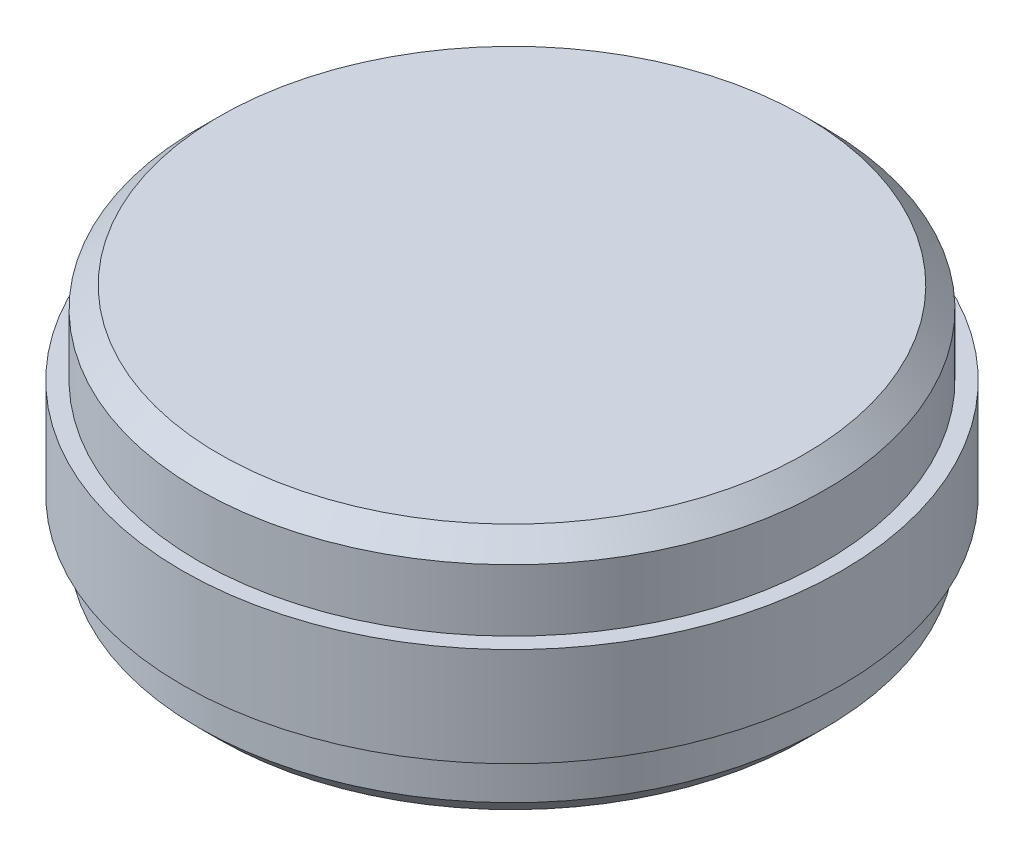
ISO-10303-21;
HEADER;
FILE_DESCRIPTION(('STEP AP214'),'2;1');
FILE_NAME('part.step','',(''),(''),'','','');
FILE_SCHEMA(('AUTOMOTIVE_DESIGN { 1 0 10303 214 1 1 1 1 }'));
ENDSEC;
DATA;
#1=APPLICATION_CONTEXT('core data for automotive mechanical design processes');
#2=APPLICATION_PROTOCOL_DEFINITION('international standard','automotive_design',2000,#1);
#3=PRODUCT_CONTEXT('',#1,'mechanical');
#4=PRODUCT('Part','Part','',(#3));
#5=PRODUCT_RELATED_PRODUCT_CATEGORY('part','',(#4));
#6=PRODUCT_DEFINITION_FORMATION('','',#4);
#7=PRODUCT_DEFINITION_CONTEXT('part definition',#1,'design');
#8=PRODUCT_DEFINITION('design','',#6,#7);
#9=PRODUCT_DEFINITION_SHAPE('','',#8);
#10=(LENGTH_UNIT() NAMED_UNIT(*) SI_UNIT(.MILLI.,.METRE.));
#11=(NAMED_UNIT(*) PLANE_ANGLE_UNIT() SI_UNIT($,.RADIAN.));
#12=(NAMED_UNIT(*) SI_UNIT($,.STERADIAN.) SOLID_ANGLE_UNIT());
#13=UNCERTAINTY_MEASURE_WITH_UNIT(LENGTH_MEASURE(1.E-05),#10,'distance_accuracy_value','');
#14=(GEOMETRIC_REPRESENTATION_CONTEXT(3) GLOBAL_UNCERTAINTY_ASSIGNED_CONTEXT((#13)) GLOBAL_UNIT_ASSIGNED_CONTEXT((#10,
#11,#12)) REPRESENTATION_CONTEXT('',''));
#15=CARTESIAN_POINT('',(0.,0.,0.));
#16=DIRECTION('',(0.,0.,1.));
#17=DIRECTION('',(1.,0.,0.));
#18=AXIS2_PLACEMENT_3D('',#15,#16,#17);
#19=CARTESIAN_POINT('',(0.,0.,0.));
#20=DIRECTION('',(0.,-1.,0.));
#21=DIRECTION('',(0.,0.,-1.));
#22=AXIS2_PLACEMENT_3D('',#19,#20,#21);
#23=PLANE('',#22);
#24=CARTESIAN_POINT('',(0.,0.,0.));
#25=DIRECTION('',(0.,-1.,0.));
#26=DIRECTION('',(0.,0.,-1.));
#27=AXIS2_PLACEMENT_3D('',#24,#25,#26);
#28=CIRCLE('',#27,22.5425);
#29=CARTESIAN_POINT('',(0.,0.,-22.5425));
#30=VERTEX_POINT('',#29);
#31=EDGE_CURVE('E60',#30,#30,#28,.F.);
#32=ORIENTED_EDGE('',*,*,#31,.T.);
#33=EDGE_LOOP('',(#32));
#34=FACE_BOUND('',#33,.T.);
#35=ADVANCED_FACE('F41',(#34),#23,.F.);
#36=CARTESIAN_POINT('',(0.,0.,0.));
#37=DIRECTION('',(0.,1.,0.));
#38=DIRECTION('',(0.,0.,1.));
#39=AXIS2_PLACEMENT_3D('',#36,#37,#38);
#40=CYLINDRICAL_SURFACE('',#39,24.13);
#41=CARTESIAN_POINT('',(0.,-1.58750000000001,0.));
#42=DIRECTION('',(0.,-1.,0.));
#43=DIRECTION('',(0.,0.,-1.));
#44=AXIS2_PLACEMENT_3D('',#41,#42,#43);
#45=CIRCLE('',#44,24.13);
#46=CARTESIAN_POINT('',(0.,-1.58750000000001,-24.13));
#47=VERTEX_POINT('',#46);
#48=EDGE_CURVE('E55',#47,#47,#45,.T.);
#49=ORIENTED_EDGE('',*,*,#48,.T.);
#50=EDGE_LOOP('',(#49));
#51=FACE_BOUND('',#50,.T.);
#52=CARTESIAN_POINT('',(0.,-6.35,0.));
#53=DIRECTION('',(0.,1.,0.));
#54=DIRECTION('',(0.,0.,1.));
#55=AXIS2_PLACEMENT_3D('',#52,#53,#54);
#56=CIRCLE('',#55,24.13);
#57=CARTESIAN_POINT('',(0.,-6.35,24.13));
#58=VERTEX_POINT('',#57);
#59=EDGE_CURVE('E66',#58,#58,#56,.T.);
#60=ORIENTED_EDGE('',*,*,#59,.T.);
#61=EDGE_LOOP('',(#60));
#62=FACE_BOUND('',#61,.T.);
#63=ADVANCED_FACE('F99',(#51,#62),#40,.T.);
#64=CARTESIAN_POINT('',(24.13,-6.35,0.));
#65=DIRECTION('',(0.,-1.,0.));
#66=DIRECTION('',(0.,0.,-1.));
#67=AXIS2_PLACEMENT_3D('',#64,#65,#66);
#68=PLANE('',#67);
#69=ORIENTED_EDGE('',*,*,#59,.F.);
#70=EDGE_LOOP('',(#69));
#71=FACE_BOUND('',#70,.T.);
#72=CARTESIAN_POINT('',(0.,-6.35,0.));
#73=DIRECTION('',(0.,1.,0.));
#74=DIRECTION('',(0.,0.,1.));
#75=AXIS2_PLACEMENT_3D('',#72,#73,#74);
#76=CIRCLE('',#75,25.4);
#77=CARTESIAN_POINT('',(0.,-6.35,25.4));
#78=VERTEX_POINT('',#77);
#79=EDGE_CURVE('E70',#78,#78,#76,.T.);
#80=ORIENTED_EDGE('',*,*,#79,.T.);
#81=EDGE_LOOP('',(#80));
#82=FACE_BOUND('',#81,.T.);
#83=ADVANCED_FACE('F105',(#71,#82),#68,.F.);
#84=CARTESIAN_POINT('',(0.,0.,0.));
#85=DIRECTION('',(0.,1.,0.));
#86=DIRECTION('',(0.,0.,1.));
#87=AXIS2_PLACEMENT_3D('',#84,#85,#86);
#88=CYLINDRICAL_SURFACE('',#87,25.4);
#89=ORIENTED_EDGE('',*,*,#79,.F.);
#90=EDGE_LOOP('',(#89));
#91=FACE_BOUND('',#90,.T.);
#92=CARTESIAN_POINT('',(0.,-13.97,0.));
#93=DIRECTION('',(0.,1.,0.));
#94=DIRECTION('',(0.,0.,1.));
#95=AXIS2_PLACEMENT_3D('',#92,#93,#94);
#96=CIRCLE('',#95,25.4);
#97=CARTESIAN_POINT('',(0.,-13.97,25.4));
#98=VERTEX_POINT('',#97);
#99=EDGE_CURVE('E74',#98,#98,#96,.T.);
#100=ORIENTED_EDGE('',*,*,#99,.T.);
#101=EDGE_LOOP('',(#100));
#102=FACE_BOUND('',#101,.T.);
#103=ADVANCED_FACE('F95',(#91,#102),#88,.T.);
#104=CARTESIAN_POINT('',(25.4,-13.97,0.));
#105=DIRECTION('',(0.,1.,0.));
#106=DIRECTION('',(0.,0.,1.));
#107=AXIS2_PLACEMENT_3D('',#104,#105,#106);
#108=PLANE('',#107);
#109=ORIENTED_EDGE('',*,*,#99,.F.);
#110=EDGE_LOOP('',(#109));
#111=FACE_BOUND('',#110,.T.);
#112=CARTESIAN_POINT('',(0.,-13.97,0.));
#113=DIRECTION('',(0.,1.,0.));
#114=DIRECTION('',(0.,0.,1.));
#115=AXIS2_PLACEMENT_3D('',#112,#113,#114);
#116=CIRCLE('',#115,24.13);
#117=CARTESIAN_POINT('',(0.,-13.97,24.13));
#118=VERTEX_POINT('',#117);
#119=EDGE_CURVE('E78',#118,#118,#116,.T.);
#120=ORIENTED_EDGE('',*,*,#119,.T.);
#121=EDGE_LOOP('',(#120));
#122=FACE_BOUND('',#121,.T.);
#123=ADVANCED_FACE('F83',(#111,#122),#108,.F.);
#124=CARTESIAN_POINT('',(0.,0.,0.));
#125=DIRECTION('',(0.,1.,0.));
#126=DIRECTION('',(0.,0.,1.));
#127=AXIS2_PLACEMENT_3D('',#124,#125,#126);
#128=CYLINDRICAL_SURFACE('',#127,24.13);
#129=CARTESIAN_POINT('',(0.,-17.4625,0.));
#130=DIRECTION('',(0.,1.,0.));
#131=DIRECTION('',(0.,0.,1.));
#132=AXIS2_PLACEMENT_3D('',#129,#130,#131);
#133=CIRCLE('',#132,24.13);
#134=CARTESIAN_POINT('',(0.,-17.4625,24.13));
#135=VERTEX_POINT('',#134);
#136=EDGE_CURVE('E50',#135,#135,#133,.T.);
#137=ORIENTED_EDGE('',*,*,#136,.T.);
#138=EDGE_LOOP('',(#137));
#139=FACE_BOUND('',#138,.T.);
#140=ORIENTED_EDGE('',*,*,#119,.F.);
#141=EDGE_LOOP('',(#140));
#142=FACE_BOUND('',#141,.T.);
#143=ADVANCED_FACE('F85',(#139,#142),#128,.T.);
#144=CARTESIAN_POINT('',(24.13,-19.05,0.));
#145=DIRECTION('',(0.,1.,0.));
#146=DIRECTION('',(0.,0.,1.));
#147=AXIS2_PLACEMENT_3D('',#144,#145,#146);
#148=PLANE('',#147);
#149=CARTESIAN_POINT('',(0.,-19.05,0.));
#150=DIRECTION('',(0.,1.,0.));
#151=DIRECTION('',(0.,0.,1.));
#152=AXIS2_PLACEMENT_3D('',#149,#150,#151);
#153=CIRCLE('',#152,22.5425);
#154=CARTESIAN_POINT('',(0.,-19.05,22.5425));
#155=VERTEX_POINT('',#154);
#156=EDGE_CURVE('E10',#155,#155,#153,.F.);
#157=ORIENTED_EDGE('',*,*,#156,.T.);
#158=EDGE_LOOP('',(#157));
#159=FACE_BOUND('',#158,.T.);
#160=ADVANCED_FACE('F87',(#159),#148,.F.);
#161=CARTESIAN_POINT('',(0.,0.,0.));
#162=DIRECTION('',(0.,-1.,0.));
#163=DIRECTION('',(0.,0.,-1.));
#164=AXIS2_PLACEMENT_3D('',#161,#162,#163);
#165=CONICAL_SURFACE('',#164,22.5425,0.785398163397444);
#166=CARTESIAN_POINT('',(0.,-1.58750000000001,-24.13));
#167=CARTESIAN_POINT('',(0.,-1.57096354166667,-24.1134635416667));
#168=CARTESIAN_POINT('',(0.,-1.55442708333334,-24.0969270833333));
#169=CARTESIAN_POINT('',(0.,-1.52135416666667,-24.0638541666667));
#170=CARTESIAN_POINT('',(0.,-1.50481770833334,-24.0473177083333));
#171=CARTESIAN_POINT('',(0.,-1.47174479166667,-24.0142447916667));
#172=CARTESIAN_POINT('',(0.,-1.45520833333334,-23.9977083333333));
#173=CARTESIAN_POINT('',(0.,-1.42213541666667,-23.9646354166667));
#174=CARTESIAN_POINT('',(0.,-1.40559895833334,-23.9480989583333));
#175=CARTESIAN_POINT('',(0.,-1.37252604166667,-23.9150260416667));
#176=CARTESIAN_POINT('',(0.,-1.35598958333334,-23.8984895833333));
#177=CARTESIAN_POINT('',(0.,-1.32291666666667,-23.8654166666667));
#178=CARTESIAN_POINT('',(0.,-1.30638020833334,-23.8488802083333));
#179=CARTESIAN_POINT('',(0.,-1.27330729166667,-23.8158072916667));
#180=CARTESIAN_POINT('',(0.,-1.25677083333334,-23.7992708333333));
#181=CARTESIAN_POINT('',(0.,-1.22369791666667,-23.7661979166667));
#182=CARTESIAN_POINT('',(0.,-1.20716145833334,-23.7496614583333));
#183=CARTESIAN_POINT('',(0.,-1.17408854166667,-23.7165885416667));
#184=CARTESIAN_POINT('',(0.,-1.15755208333334,-23.7000520833333));
#185=CARTESIAN_POINT('',(0.,-1.12447916666667,-23.6669791666667));
#186=CARTESIAN_POINT('',(0.,-1.10794270833334,-23.6504427083333));
#187=CARTESIAN_POINT('',(0.,-1.07486979166667,-23.6173697916667));
#188=CARTESIAN_POINT('',(0.,-1.05833333333334,-23.6008333333333));
#189=CARTESIAN_POINT('',(0.,-1.02526041666667,-23.5677604166667));
#190=CARTESIAN_POINT('',(0.,-1.00872395833334,-23.5512239583333));
#191=CARTESIAN_POINT('',(0.,-0.97565104166667,-23.5181510416667));
#192=CARTESIAN_POINT('',(0.,-0.959114583333337,-23.5016145833333));
#193=CARTESIAN_POINT('',(0.,-0.92604166666667,-23.4685416666667));
#194=CARTESIAN_POINT('',(0.,-0.909505208333336,-23.4520052083333));
#195=CARTESIAN_POINT('',(0.,-0.87643229166667,-23.4189322916667));
#196=CARTESIAN_POINT('',(0.,-0.859895833333337,-23.4023958333333));
#197=CARTESIAN_POINT('',(0.,-0.82682291666667,-23.3693229166667));
#198=CARTESIAN_POINT('',(0.,-0.810286458333336,-23.3527864583333));
#199=CARTESIAN_POINT('',(0.,-0.777213541666669,-23.3197135416667));
#200=CARTESIAN_POINT('',(0.,-0.760677083333336,-23.3031770833333));
#201=CARTESIAN_POINT('',(0.,-0.727604166666669,-23.2701041666667));
#202=CARTESIAN_POINT('',(0.,-0.711067708333336,-23.2535677083333));
#203=CARTESIAN_POINT('',(0.,-0.677994791666669,-23.2204947916667));
#204=CARTESIAN_POINT('',(0.,-0.661458333333336,-23.2039583333333));
#205=CARTESIAN_POINT('',(0.,-0.628385416666669,-23.1708854166667));
#206=CARTESIAN_POINT('',(0.,-0.611848958333336,-23.1543489583333));
#207=CARTESIAN_POINT('',(0.,-0.578776041666669,-23.1212760416667));
#208=CARTESIAN_POINT('',(0.,-0.562239583333335,-23.1047395833333));
#209=CARTESIAN_POINT('',(0.,-0.529166666666669,-23.0716666666667));
#210=CARTESIAN_POINT('',(0.,-0.512630208333335,-23.0551302083333));
#211=CARTESIAN_POINT('',(0.,-0.479557291666668,-23.0220572916667));
#212=CARTESIAN_POINT('',(0.,-0.463020833333335,-23.0055208333333));
#213=CARTESIAN_POINT('',(0.,-0.429947916666669,-22.9724479166667));
#214=CARTESIAN_POINT('',(0.,-0.413411458333335,-22.9559114583333));
#215=CARTESIAN_POINT('',(0.,-0.380338541666668,-22.9228385416667));
#216=CARTESIAN_POINT('',(0.,-0.363802083333335,-22.9063020833333));
#217=CARTESIAN_POINT('',(0.,-0.330729166666668,-22.8732291666667));
#218=CARTESIAN_POINT('',(0.,-0.314192708333334,-22.8566927083333));
#219=CARTESIAN_POINT('',(0.,-0.281119791666667,-22.8236197916667));
#220=CARTESIAN_POINT('',(0.,-0.264583333333334,-22.8070833333333));
#221=CARTESIAN_POINT('',(0.,-0.231510416666668,-22.7740104166667));
#222=CARTESIAN_POINT('',(0.,-0.214973958333334,-22.7574739583333));
#223=CARTESIAN_POINT('',(0.,-0.181901041666667,-22.7244010416667));
#224=CARTESIAN_POINT('',(0.,-0.165364583333334,-22.7078645833333));
#225=CARTESIAN_POINT('',(0.,-0.132291666666667,-22.6747916666667));
#226=CARTESIAN_POINT('',(0.,-0.115755208333334,-22.6582552083333));
#227=CARTESIAN_POINT('',(0.,-0.0826822916666673,-22.6251822916667));
#228=CARTESIAN_POINT('',(0.,-0.0661458333333338,-22.6086458333333));
#229=CARTESIAN_POINT('',(0.,-0.0330729166666666,-22.5755729166667));
#230=CARTESIAN_POINT('',(0.,-0.016536458333333,-22.5590364583333));
#231=CARTESIAN_POINT('',(0.,0.,-22.5425));
#232=B_SPLINE_CURVE_WITH_KNOTS('',3,(#166,#167,#168,#169,#170,#171,#172,#173,#174,#175,#176,
#177,#178,#179,#180,#181,#182,#183,#184,#185,#186,#187,#188,#189,#190,#191,#192,#193,#194,#195,
#196,#197,#198,#199,#200,#201,#202,#203,#204,#205,#206,#207,#208,#209,#210,#211,#212,#213,#214,
#215,#216,#217,#218,#219,#220,#221,#222,#223,#224,#225,#226,#227,#228,#229,#230,#231),
.UNSPECIFIED.,.F.,.F.,(4,2,2,2,2,2,2,2,2,2,2,2,2,2,2,2,2,2,2,2,2,2,2,2,2,2,2,2,2,2,2,2,4),(0.,
0.0701582509458521,0.140316501891704,0.210474752837559,0.280633003783411,0.350791254729263,
0.420949505675115,0.49110775662097,0.561266007566822,0.631424258512674,0.701582509458526,
0.77174076040438,0.841899011350232,0.912057262296085,0.982215513241937,1.05237376418779,
1.12253201513364,1.1926902660795,1.26284851702535,1.3330067679712,1.40316501891705,
1.47332326986291,1.54348152080876,1.61363977175461,1.68379802270046,1.75395627364632,
1.82411452459217,1.89427277553802,1.96443102648388,2.03458927742973,2.10474752837558,
2.17490577932143,2.24506403026729),.UNSPECIFIED.);
#233=EDGE_CURVE('BSEAM93',#47,#30,#232,.T.);
#234=ORIENTED_EDGE('',*,*,#48,.F.);
#235=ORIENTED_EDGE('',*,*,#31,.F.);
#236=ORIENTED_EDGE('',*,*,#233,.T.);
#237=ORIENTED_EDGE('',*,*,#233,.F.);
#238=EDGE_LOOP('',(#234,#236,#235,#237));
#239=FACE_BOUND('',#238,.T.);
#240=ADVANCED_FACE('F93',(#239),#165,.T.);
#241=CARTESIAN_POINT('',(0.,-17.4625,0.));
#242=DIRECTION('',(0.,1.,0.));
#243=DIRECTION('',(0.,0.,1.));
#244=AXIS2_PLACEMENT_3D('',#241,#242,#243);
#245=CONICAL_SURFACE('',#244,24.13,0.785398163397452);
#246=CARTESIAN_POINT('',(0.,-19.05,22.5425));
#247=CARTESIAN_POINT('',(0.,-19.0334635416667,22.5590364583333));
#248=CARTESIAN_POINT('',(0.,-19.0169270833333,22.5755729166666));
#249=CARTESIAN_POINT('',(0.,-18.9838541666667,22.6086458333333));
#250=CARTESIAN_POINT('',(0.,-18.9673177083333,22.6251822916666));
#251=CARTESIAN_POINT('',(0.,-18.9342447916667,22.6582552083333));
#252=CARTESIAN_POINT('',(0.,-18.9177083333333,22.6747916666666));
#253=CARTESIAN_POINT('',(0.,-18.8846354166667,22.7078645833333));
#254=CARTESIAN_POINT('',(0.,-18.8680989583333,22.7244010416666));
#255=CARTESIAN_POINT('',(0.,-18.8350260416667,22.7574739583333));
#256=CARTESIAN_POINT('',(0.,-18.8184895833333,22.7740104166666));
#257=CARTESIAN_POINT('',(0.,-18.7854166666667,22.8070833333333));
#258=CARTESIAN_POINT('',(0.,-18.7688802083333,22.8236197916666));
#259=CARTESIAN_POINT('',(0.,-18.7358072916667,22.8566927083333));
#260=CARTESIAN_POINT('',(0.,-18.7192708333333,22.8732291666667));
#261=CARTESIAN_POINT('',(0.,-18.6861979166667,22.9063020833333));
#262=CARTESIAN_POINT('',(0.,-18.6696614583333,22.9228385416666));
#263=CARTESIAN_POINT('',(0.,-18.6365885416667,22.9559114583333));
#264=CARTESIAN_POINT('',(0.,-18.6200520833333,22.9724479166667));
#265=CARTESIAN_POINT('',(0.,-18.5869791666667,23.0055208333333));
#266=CARTESIAN_POINT('',(0.,-18.5704427083333,23.0220572916667));
#267=CARTESIAN_POINT('',(0.,-18.5373697916667,23.0551302083333));
#268=CARTESIAN_POINT('',(0.,-18.5208333333333,23.0716666666667));
#269=CARTESIAN_POINT('',(0.,-18.4877604166667,23.1047395833333));
#270=CARTESIAN_POINT('',(0.,-18.4712239583333,23.1212760416667));
#271=CARTESIAN_POINT('',(0.,-18.4381510416667,23.1543489583333));
#272=CARTESIAN_POINT('',(0.,-18.4216145833333,23.1708854166667));
#273=CARTESIAN_POINT('',(0.,-18.3885416666667,23.2039583333333));
#274=CARTESIAN_POINT('',(0.,-18.3720052083333,23.2204947916667));
#275=CARTESIAN_POINT('',(0.,-18.3389322916667,23.2535677083333));
#276=CARTESIAN_POINT('',(0.,-18.3223958333333,23.2701041666667));
#277=CARTESIAN_POINT('',(0.,-18.2893229166667,23.3031770833333));
#278=CARTESIAN_POINT('',(0.,-18.2727864583333,23.3197135416667));
#279=CARTESIAN_POINT('',(0.,-18.2397135416667,23.3527864583333));
#280=CARTESIAN_POINT('',(0.,-18.2231770833333,23.3693229166667));
#281=CARTESIAN_POINT('',(0.,-18.1901041666667,23.4023958333333));
#282=CARTESIAN_POINT('',(0.,-18.1735677083333,23.4189322916667));
#283=CARTESIAN_POINT('',(0.,-18.1404947916667,23.4520052083333));
#284=CARTESIAN_POINT('',(0.,-18.1239583333333,23.4685416666667));
#285=CARTESIAN_POINT('',(0.,-18.0908854166667,23.5016145833333));
#286=CARTESIAN_POINT('',(0.,-18.0743489583333,23.5181510416667));
#287=CARTESIAN_POINT('',(0.,-18.0412760416667,23.5512239583333));
#288=CARTESIAN_POINT('',(0.,-18.0247395833333,23.5677604166667));
#289=CARTESIAN_POINT('',(0.,-17.9916666666667,23.6008333333333));
#290=CARTESIAN_POINT('',(0.,-17.9751302083333,23.6173697916667));
#291=CARTESIAN_POINT('',(0.,-17.9420572916667,23.6504427083333));
#292=CARTESIAN_POINT('',(0.,-17.9255208333333,23.6669791666667));
#293=CARTESIAN_POINT('',(0.,-17.8924479166667,23.7000520833333));
#294=CARTESIAN_POINT('',(0.,-17.8759114583333,23.7165885416667));
#295=CARTESIAN_POINT('',(0.,-17.8428385416667,23.7496614583333));
#296=CARTESIAN_POINT('',(0.,-17.8263020833333,23.7661979166667));
#297=CARTESIAN_POINT('',(0.,-17.7932291666667,23.7992708333333));
#298=CARTESIAN_POINT('',(0.,-17.7766927083333,23.8158072916667));
#299=CARTESIAN_POINT('',(0.,-17.7436197916667,23.8488802083333));
#300=CARTESIAN_POINT('',(0.,-17.7270833333333,23.8654166666667));
#301=CARTESIAN_POINT('',(0.,-17.6940104166667,23.8984895833333));
#302=CARTESIAN_POINT('',(0.,-17.6774739583333,23.9150260416667));
#303=CARTESIAN_POINT('',(0.,-17.6444010416667,23.9480989583333));
#304=CARTESIAN_POINT('',(0.,-17.6278645833333,23.9646354166667));
#305=CARTESIAN_POINT('',(0.,-17.5947916666667,23.9977083333333));
#306=CARTESIAN_POINT('',(0.,-17.5782552083333,24.0142447916667));
#307=CARTESIAN_POINT('',(0.,-17.5451822916667,24.0473177083333));
#308=CARTESIAN_POINT('',(0.,-17.5286458333333,24.0638541666667));
#309=CARTESIAN_POINT('',(0.,-17.4955729166667,24.0969270833333));
#310=CARTESIAN_POINT('',(0.,-17.4790364583333,24.1134635416667));
#311=CARTESIAN_POINT('',(0.,-17.4625,24.13));
#312=B_SPLINE_CURVE_WITH_KNOTS('',3,(#246,#247,#248,#249,#250,#251,#252,#253,#254,#255,#256,
#257,#258,#259,#260,#261,#262,#263,#264,#265,#266,#267,#268,#269,#270,#271,#272,#273,#274,#275,
#276,#277,#278,#279,#280,#281,#282,#283,#284,#285,#286,#287,#288,#289,#290,#291,#292,#293,#294,
#295,#296,#297,#298,#299,#300,#301,#302,#303,#304,#305,#306,#307,#308,#309,#310,#311),
.UNSPECIFIED.,.F.,.F.,(4,2,2,2,2,2,2,2,2,2,2,2,2,2,2,2,2,2,2,2,2,2,2,2,2,2,2,2,2,2,2,2,4),(0.,
0.0701582509458561,0.140316501891707,0.210474752837563,0.280633003783414,0.350791254729268,
0.420949505675122,0.491107756620975,0.561266007566827,0.631424258512683,0.701582509458534,
0.771740760404387,0.841899011350241,0.912057262296095,0.982215513241948,1.0523737641878,
1.12253201513365,1.19269026607951,1.26284851702536,1.33300676797121,1.40316501891707,
1.47332326986292,1.54348152080877,1.61363977175463,1.68379802270048,1.75395627364633,
1.82411452459219,1.89427277553804,1.96443102648389,2.03458927742974,2.1047475283756,
2.17490577932145,2.24506403026731),.UNSPECIFIED.);
#313=EDGE_CURVE('BSEAM44',#155,#135,#312,.T.);
#314=ORIENTED_EDGE('',*,*,#156,.F.);
#315=ORIENTED_EDGE('',*,*,#136,.F.);
#316=ORIENTED_EDGE('',*,*,#313,.T.);
#317=ORIENTED_EDGE('',*,*,#313,.F.);
#318=EDGE_LOOP('',(#314,#316,#315,#317));
#319=FACE_BOUND('',#318,.T.);
#320=ADVANCED_FACE('F44',(#319),#245,.T.);
#321=CLOSED_SHELL('',(#35,#63,#83,#103,#123,#143,#160,#240,#320));
#322=MANIFOLD_SOLID_BREP('B2',#321);
#323=ADVANCED_BREP_SHAPE_REPRESENTATION('',(#18,#322),#14);
#324=SHAPE_DEFINITION_REPRESENTATION(#9,#323);
ENDSEC;
END-ISO-10303-21;
